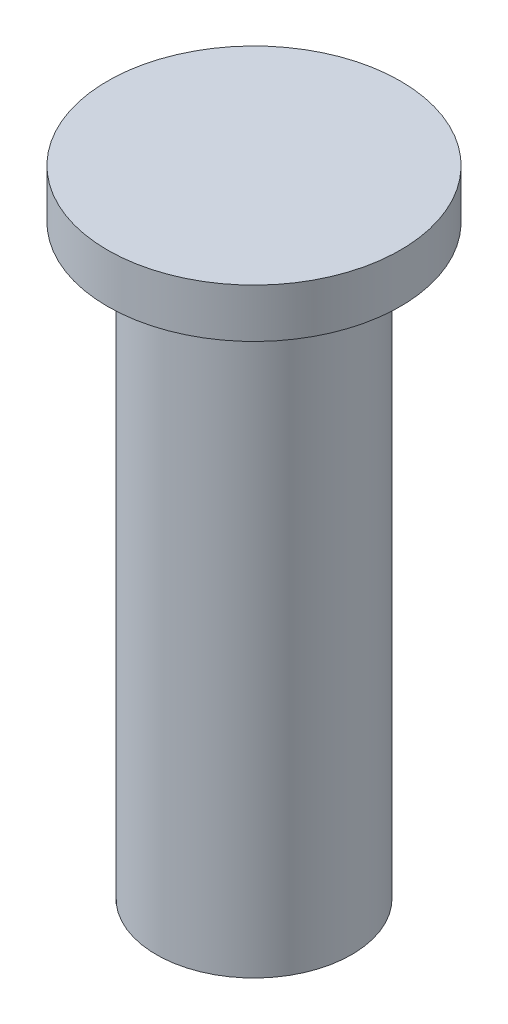
ISO-10303-21;
HEADER;
FILE_DESCRIPTION(('STEP AP214'),'2;1');
FILE_NAME('part.step','',(''),(''),'','','');
FILE_SCHEMA(('AUTOMOTIVE_DESIGN { 1 0 10303 214 1 1 1 1 }'));
ENDSEC;
DATA;
#1=APPLICATION_CONTEXT('core data for automotive mechanical design processes');
#2=APPLICATION_PROTOCOL_DEFINITION('international standard','automotive_design',2000,#1);
#3=PRODUCT_CONTEXT('',#1,'mechanical');
#4=PRODUCT('Part','Part','',(#3));
#5=PRODUCT_RELATED_PRODUCT_CATEGORY('part','',(#4));
#6=PRODUCT_DEFINITION_FORMATION('','',#4);
#7=PRODUCT_DEFINITION_CONTEXT('part definition',#1,'design');
#8=PRODUCT_DEFINITION('design','',#6,#7);
#9=PRODUCT_DEFINITION_SHAPE('','',#8);
#10=(LENGTH_UNIT() NAMED_UNIT(*) SI_UNIT(.MILLI.,.METRE.));
#11=(NAMED_UNIT(*) PLANE_ANGLE_UNIT() SI_UNIT($,.RADIAN.));
#12=(NAMED_UNIT(*) SI_UNIT($,.STERADIAN.) SOLID_ANGLE_UNIT());
#13=UNCERTAINTY_MEASURE_WITH_UNIT(LENGTH_MEASURE(1.E-05),#10,'distance_accuracy_value','');
#14=(GEOMETRIC_REPRESENTATION_CONTEXT(3) GLOBAL_UNCERTAINTY_ASSIGNED_CONTEXT((#13)) GLOBAL_UNIT_ASSIGNED_CONTEXT((#10,
#11,#12)) REPRESENTATION_CONTEXT('',''));
#15=CARTESIAN_POINT('',(0.,0.,0.));
#16=DIRECTION('',(0.,0.,1.));
#17=DIRECTION('',(1.,0.,0.));
#18=AXIS2_PLACEMENT_3D('',#15,#16,#17);
#19=CARTESIAN_POINT('',(0.,76.2,0.));
#20=DIRECTION('',(0.,-1.,0.));
#21=DIRECTION('',(0.,0.,-1.));
#22=AXIS2_PLACEMENT_3D('',#19,#20,#21);
#23=CYLINDRICAL_SURFACE('',#22,12.7);
#24=CARTESIAN_POINT('',(0.,76.2,0.));
#25=DIRECTION('',(0.,1.,0.));
#26=DIRECTION('',(0.,0.,1.));
#27=AXIS2_PLACEMENT_3D('',#24,#25,#26);
#28=CIRCLE('',#27,12.7);
#29=CARTESIAN_POINT('',(0.,76.2,-12.7));
#30=VERTEX_POINT('',#29);
#31=EDGE_CURVE('E10',#30,#30,#28,.T.);
#32=CARTESIAN_POINT('',(0.,0.,0.));
#33=DIRECTION('',(0.,1.,0.));
#34=DIRECTION('',(0.,0.,1.));
#35=AXIS2_PLACEMENT_3D('',#32,#33,#34);
#36=CIRCLE('',#35,12.7);
#37=CARTESIAN_POINT('',(0.,0.,-12.7));
#38=VERTEX_POINT('',#37);
#39=EDGE_CURVE('E46',#38,#38,#36,.T.);
#40=CARTESIAN_POINT('',(0.,76.2,-12.7));
#41=CARTESIAN_POINT('',(0.,75.40625,-12.7));
#42=CARTESIAN_POINT('',(0.,74.6125,-12.7));
#43=CARTESIAN_POINT('',(0.,73.025,-12.7));
#44=CARTESIAN_POINT('',(0.,72.23125,-12.7));
#45=CARTESIAN_POINT('',(0.,70.64375,-12.7));
#46=CARTESIAN_POINT('',(0.,69.85,-12.7));
#47=CARTESIAN_POINT('',(0.,68.2625,-12.7));
#48=CARTESIAN_POINT('',(0.,67.46875,-12.7));
#49=CARTESIAN_POINT('',(0.,65.88125,-12.7));
#50=CARTESIAN_POINT('',(0.,65.0875,-12.7));
#51=CARTESIAN_POINT('',(0.,63.5,-12.7));
#52=CARTESIAN_POINT('',(0.,62.70625,-12.7));
#53=CARTESIAN_POINT('',(0.,61.11875,-12.7));
#54=CARTESIAN_POINT('',(0.,60.325,-12.7));
#55=CARTESIAN_POINT('',(0.,58.7375,-12.7));
#56=CARTESIAN_POINT('',(0.,57.94375,-12.7));
#57=CARTESIAN_POINT('',(0.,56.35625,-12.7));
#58=CARTESIAN_POINT('',(0.,55.5625,-12.7));
#59=CARTESIAN_POINT('',(0.,53.975,-12.7));
#60=CARTESIAN_POINT('',(0.,53.18125,-12.7));
#61=CARTESIAN_POINT('',(0.,51.59375,-12.7));
#62=CARTESIAN_POINT('',(0.,50.8,-12.7));
#63=CARTESIAN_POINT('',(0.,49.2125,-12.7));
#64=CARTESIAN_POINT('',(0.,48.41875,-12.7));
#65=CARTESIAN_POINT('',(0.,46.83125,-12.7));
#66=CARTESIAN_POINT('',(0.,46.0375,-12.7));
#67=CARTESIAN_POINT('',(0.,44.45,-12.7));
#68=CARTESIAN_POINT('',(0.,43.65625,-12.7));
#69=CARTESIAN_POINT('',(0.,42.06875,-12.7));
#70=CARTESIAN_POINT('',(0.,41.275,-12.7));
#71=CARTESIAN_POINT('',(0.,39.6875,-12.7));
#72=CARTESIAN_POINT('',(0.,38.89375,-12.7));
#73=CARTESIAN_POINT('',(0.,37.30625,-12.7));
#74=CARTESIAN_POINT('',(0.,36.5125,-12.7));
#75=CARTESIAN_POINT('',(0.,34.925,-12.7));
#76=CARTESIAN_POINT('',(0.,34.13125,-12.7));
#77=CARTESIAN_POINT('',(0.,32.54375,-12.7));
#78=CARTESIAN_POINT('',(0.,31.75,-12.7));
#79=CARTESIAN_POINT('',(0.,30.1625,-12.7));
#80=CARTESIAN_POINT('',(0.,29.36875,-12.7));
#81=CARTESIAN_POINT('',(0.,27.78125,-12.7));
#82=CARTESIAN_POINT('',(0.,26.9875,-12.7));
#83=CARTESIAN_POINT('',(0.,25.4,-12.7));
#84=CARTESIAN_POINT('',(0.,24.60625,-12.7));
#85=CARTESIAN_POINT('',(0.,23.01875,-12.7));
#86=CARTESIAN_POINT('',(0.,22.225,-12.7));
#87=CARTESIAN_POINT('',(0.,20.6375,-12.7));
#88=CARTESIAN_POINT('',(0.,19.84375,-12.7));
#89=CARTESIAN_POINT('',(0.,18.25625,-12.7));
#90=CARTESIAN_POINT('',(0.,17.4625,-12.7));
#91=CARTESIAN_POINT('',(0.,15.875,-12.7));
#92=CARTESIAN_POINT('',(0.,15.08125,-12.7));
#93=CARTESIAN_POINT('',(0.,13.49375,-12.7));
#94=CARTESIAN_POINT('',(0.,12.7,-12.7));
#95=CARTESIAN_POINT('',(0.,11.1125,-12.7));
#96=CARTESIAN_POINT('',(0.,10.31875,-12.7));
#97=CARTESIAN_POINT('',(0.,8.73125,-12.7));
#98=CARTESIAN_POINT('',(0.,7.93750000000001,-12.7));
#99=CARTESIAN_POINT('',(0.,6.35,-12.7));
#100=CARTESIAN_POINT('',(0.,5.55625,-12.7));
#101=CARTESIAN_POINT('',(0.,3.96875,-12.7));
#102=CARTESIAN_POINT('',(0.,3.175,-12.7));
#103=CARTESIAN_POINT('',(0.,1.5875,-12.7));
#104=CARTESIAN_POINT('',(0.,0.793750000000001,-12.7));
#105=CARTESIAN_POINT('',(0.,0.,-12.7));
#106=B_SPLINE_CURVE_WITH_KNOTS('',3,(#40,#41,#42,#43,#44,#45,#46,#47,#48,#49,#50,#51,#52,#53,
#54,#55,#56,#57,#58,#59,#60,#61,#62,#63,#64,#65,#66,#67,#68,#69,#70,#71,#72,#73,#74,#75,#76,#77,
#78,#79,#80,#81,#82,#83,#84,#85,#86,#87,#88,#89,#90,#91,#92,#93,#94,#95,#96,#97,#98,#99,#100,
#101,#102,#103,#104,#105),.UNSPECIFIED.,.F.,.F.,(4,2,2,2,2,2,2,2,2,2,2,2,2,2,2,2,2,2,2,2,2,2,2,
2,2,2,2,2,2,2,2,2,4),(0.,2.38124999999999,4.76249999999999,7.14374999999999,9.52499999999999,
11.90625,14.2875,16.66875,19.05,21.43125,23.8125,26.19375,28.575,30.95625,33.3375,35.71875,38.1,
40.48125,42.8625,45.24375,47.625,50.00625,52.3875,54.76875,57.15,59.53125,61.9125,64.29375,
66.675,69.05625,71.4375,73.81875,76.2),.UNSPECIFIED.);
#107=EDGE_CURVE('BSEAM43',#30,#38,#106,.T.);
#108=ORIENTED_EDGE('',*,*,#31,.F.);
#109=ORIENTED_EDGE('',*,*,#39,.T.);
#110=ORIENTED_EDGE('',*,*,#107,.T.);
#111=ORIENTED_EDGE('',*,*,#107,.F.);
#112=EDGE_LOOP('',(#108,#110,#109,#111));
#113=FACE_BOUND('',#112,.T.);
#114=ADVANCED_FACE('F43',(#113),#23,.T.);
#115=CARTESIAN_POINT('',(0.,0.,0.));
#116=DIRECTION('',(0.,1.,0.));
#117=DIRECTION('',(0.,0.,1.));
#118=AXIS2_PLACEMENT_3D('',#115,#116,#117);
#119=PLANE('',#118);
#120=ORIENTED_EDGE('',*,*,#39,.F.);
#121=EDGE_LOOP('',(#120));
#122=FACE_BOUND('',#121,.T.);
#123=ADVANCED_FACE('F70',(#122),#119,.F.);
#124=CARTESIAN_POINT('',(0.,82.55,0.));
#125=DIRECTION('',(0.,-1.,0.));
#126=DIRECTION('',(0.,0.,-1.));
#127=AXIS2_PLACEMENT_3D('',#124,#125,#126);
#128=CYLINDRICAL_SURFACE('',#127,19.05);
#129=CARTESIAN_POINT('',(0.,82.55,0.));
#130=DIRECTION('',(0.,1.,0.));
#131=DIRECTION('',(0.,0.,1.));
#132=AXIS2_PLACEMENT_3D('',#129,#130,#131);
#133=CIRCLE('',#132,19.05);
#134=CARTESIAN_POINT('',(0.,82.55,19.05));
#135=VERTEX_POINT('',#134);
#136=EDGE_CURVE('E55',#135,#135,#133,.T.);
#137=ORIENTED_EDGE('',*,*,#136,.F.);
#138=EDGE_LOOP('',(#137));
#139=FACE_BOUND('',#138,.T.);
#140=CARTESIAN_POINT('',(0.,76.2,0.));
#141=DIRECTION('',(0.,1.,0.));
#142=DIRECTION('',(0.,0.,1.));
#143=AXIS2_PLACEMENT_3D('',#140,#141,#142);
#144=CIRCLE('',#143,19.05);
#145=CARTESIAN_POINT('',(0.,76.2,19.05));
#146=VERTEX_POINT('',#145);
#147=EDGE_CURVE('E57',#146,#146,#144,.T.);
#148=ORIENTED_EDGE('',*,*,#147,.T.);
#149=EDGE_LOOP('',(#148));
#150=FACE_BOUND('',#149,.T.);
#151=ADVANCED_FACE('F67',(#139,#150),#128,.T.);
#152=CARTESIAN_POINT('',(0.,82.55,0.));
#153=DIRECTION('',(0.,1.,0.));
#154=DIRECTION('',(0.,0.,1.));
#155=AXIS2_PLACEMENT_3D('',#152,#153,#154);
#156=PLANE('',#155);
#157=ORIENTED_EDGE('',*,*,#136,.T.);
#158=EDGE_LOOP('',(#157));
#159=FACE_BOUND('',#158,.T.);
#160=ADVANCED_FACE('F65',(#159),#156,.T.);
#161=CARTESIAN_POINT('',(0.,76.2,0.));
#162=DIRECTION('',(0.,1.,0.));
#163=DIRECTION('',(0.,0.,1.));
#164=AXIS2_PLACEMENT_3D('',#161,#162,#163);
#165=PLANE('',#164);
#166=ORIENTED_EDGE('',*,*,#31,.T.);
#167=EDGE_LOOP('',(#166));
#168=FACE_BOUND('',#167,.T.);
#169=ORIENTED_EDGE('',*,*,#147,.F.);
#170=EDGE_LOOP('',(#169));
#171=FACE_BOUND('',#170,.T.);
#172=ADVANCED_FACE('F74',(#168,#171),#165,.F.);
#173=CLOSED_SHELL('',(#114,#123,#151,#160,#172));
#174=MANIFOLD_SOLID_BREP('B2',#173);
#175=ADVANCED_BREP_SHAPE_REPRESENTATION('',(#18,#174),#14);
#176=SHAPE_DEFINITION_REPRESENTATION(#9,#175);
ENDSEC;
END-ISO-10303-21;
